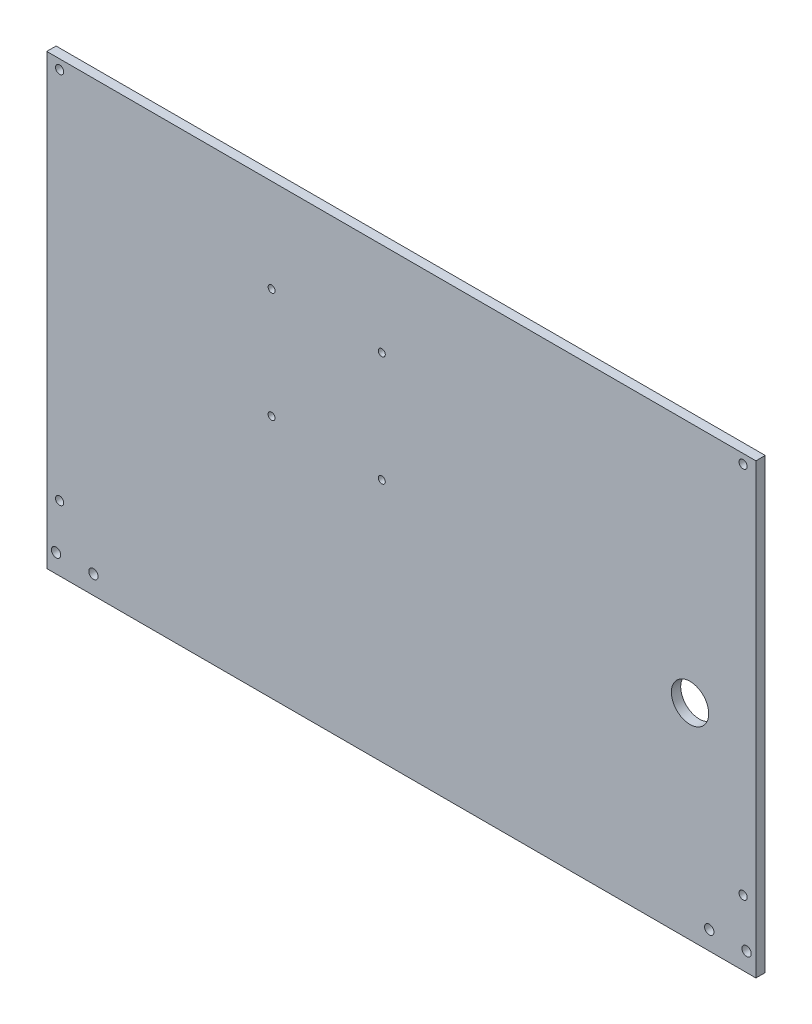
ISO-10303-21;
HEADER;
FILE_DESCRIPTION(('STEP AP214'),'2;1');
FILE_NAME('part.step','',(''),(''),'','','');
FILE_SCHEMA(('AUTOMOTIVE_DESIGN { 1 0 10303 214 1 1 1 1 }'));
ENDSEC;
DATA;
#1=APPLICATION_CONTEXT('core data for automotive mechanical design processes');
#2=APPLICATION_PROTOCOL_DEFINITION('international standard','automotive_design',2000,#1);
#3=PRODUCT_CONTEXT('',#1,'mechanical');
#4=PRODUCT('Part','Part','',(#3));
#5=PRODUCT_RELATED_PRODUCT_CATEGORY('part','',(#4));
#6=PRODUCT_DEFINITION_FORMATION('','',#4);
#7=PRODUCT_DEFINITION_CONTEXT('part definition',#1,'design');
#8=PRODUCT_DEFINITION('design','',#6,#7);
#9=PRODUCT_DEFINITION_SHAPE('','',#8);
#10=(LENGTH_UNIT() NAMED_UNIT(*) SI_UNIT(.MILLI.,.METRE.));
#11=(NAMED_UNIT(*) PLANE_ANGLE_UNIT() SI_UNIT($,.RADIAN.));
#12=(NAMED_UNIT(*) SI_UNIT($,.STERADIAN.) SOLID_ANGLE_UNIT());
#13=UNCERTAINTY_MEASURE_WITH_UNIT(LENGTH_MEASURE(1.E-05),#10,'distance_accuracy_value','');
#14=(GEOMETRIC_REPRESENTATION_CONTEXT(3) GLOBAL_UNCERTAINTY_ASSIGNED_CONTEXT((#13)) GLOBAL_UNIT_ASSIGNED_CONTEXT((#10,
#11,#12)) REPRESENTATION_CONTEXT('',''));
#15=CARTESIAN_POINT('',(0.,0.,0.));
#16=DIRECTION('',(0.,0.,1.));
#17=DIRECTION('',(1.,0.,0.));
#18=AXIS2_PLACEMENT_3D('',#15,#16,#17);
#19=CARTESIAN_POINT('',(241.3,-152.4,6.35));
#20=DIRECTION('',(-1.,0.,0.));
#21=DIRECTION('',(0.,0.,1.));
#22=AXIS2_PLACEMENT_3D('',#19,#20,#21);
#23=PLANE('',#22);
#24=DIRECTION('',(0.,1.,0.));
#25=VECTOR('',#24,1.);
#26=CARTESIAN_POINT('',(241.3,-152.4,0.));
#27=LINE('',#26,#25);
#28=CARTESIAN_POINT('',(241.3,-152.4,0.));
#29=VERTEX_POINT('',#28);
#30=CARTESIAN_POINT('',(241.3,152.4,0.));
#31=VERTEX_POINT('',#30);
#32=EDGE_CURVE('E110',#29,#31,#27,.T.);
#33=ORIENTED_EDGE('',*,*,#32,.T.);
#34=DIRECTION('',(0.,0.,-1.));
#35=VECTOR('',#34,1.);
#36=CARTESIAN_POINT('',(241.3,152.4,6.35));
#37=LINE('',#36,#35);
#38=CARTESIAN_POINT('',(241.3,152.4,6.35));
#39=VERTEX_POINT('',#38);
#40=EDGE_CURVE('E11',#39,#31,#37,.T.);
#41=ORIENTED_EDGE('',*,*,#40,.F.);
#42=DIRECTION('',(0.,1.,0.));
#43=VECTOR('',#42,1.);
#44=CARTESIAN_POINT('',(241.3,-152.4,6.35));
#45=LINE('',#44,#43);
#46=CARTESIAN_POINT('',(241.3,-152.4,6.35));
#47=VERTEX_POINT('',#46);
#48=EDGE_CURVE('E94',#47,#39,#45,.T.);
#49=ORIENTED_EDGE('',*,*,#48,.F.);
#50=DIRECTION('',(0.,0.,-1.));
#51=VECTOR('',#50,1.);
#52=CARTESIAN_POINT('',(241.3,-152.4,6.35));
#53=LINE('',#52,#51);
#54=EDGE_CURVE('E106',#47,#29,#53,.T.);
#55=ORIENTED_EDGE('',*,*,#54,.T.);
#56=EDGE_LOOP('',(#33,#41,#49,#55));
#57=FACE_BOUND('',#56,.T.);
#58=ADVANCED_FACE('F42',(#57),#23,.F.);
#59=CARTESIAN_POINT('',(-241.3,152.4,6.35));
#60=DIRECTION('',(0.,-1.,0.));
#61=DIRECTION('',(0.,0.,-1.));
#62=AXIS2_PLACEMENT_3D('',#59,#60,#61);
#63=PLANE('',#62);
#64=DIRECTION('',(-1.,0.,0.));
#65=VECTOR('',#64,1.);
#66=CARTESIAN_POINT('',(-241.3,152.4,0.));
#67=LINE('',#66,#65);
#68=CARTESIAN_POINT('',(-241.3,152.4,0.));
#69=VERTEX_POINT('',#68);
#70=EDGE_CURVE('E99',#31,#69,#67,.T.);
#71=ORIENTED_EDGE('',*,*,#70,.T.);
#72=DIRECTION('',(0.,0.,-1.));
#73=VECTOR('',#72,1.);
#74=CARTESIAN_POINT('',(-241.3,152.4,6.35));
#75=LINE('',#74,#73);
#76=CARTESIAN_POINT('',(-241.3,152.4,6.35));
#77=VERTEX_POINT('',#76);
#78=EDGE_CURVE('E51',#77,#69,#75,.T.);
#79=ORIENTED_EDGE('',*,*,#78,.F.);
#80=DIRECTION('',(-1.,0.,0.));
#81=VECTOR('',#80,1.);
#82=CARTESIAN_POINT('',(-241.3,152.4,6.35));
#83=LINE('',#82,#81);
#84=EDGE_CURVE('E89',#39,#77,#83,.T.);
#85=ORIENTED_EDGE('',*,*,#84,.F.);
#86=ORIENTED_EDGE('',*,*,#40,.T.);
#87=EDGE_LOOP('',(#71,#79,#85,#86));
#88=FACE_BOUND('',#87,.T.);
#89=ADVANCED_FACE('F98',(#88),#63,.F.);
#90=CARTESIAN_POINT('',(-241.3,-152.4,6.35));
#91=DIRECTION('',(1.,0.,0.));
#92=DIRECTION('',(0.,0.,-1.));
#93=AXIS2_PLACEMENT_3D('',#90,#91,#92);
#94=PLANE('',#93);
#95=DIRECTION('',(0.,-1.,0.));
#96=VECTOR('',#95,1.);
#97=CARTESIAN_POINT('',(-241.3,-152.4,0.));
#98=LINE('',#97,#96);
#99=CARTESIAN_POINT('',(-241.3,-152.4,0.));
#100=VERTEX_POINT('',#99);
#101=EDGE_CURVE('E76',#69,#100,#98,.T.);
#102=ORIENTED_EDGE('',*,*,#101,.T.);
#103=DIRECTION('',(0.,0.,-1.));
#104=VECTOR('',#103,1.);
#105=CARTESIAN_POINT('',(-241.3,-152.4,6.35));
#106=LINE('',#105,#104);
#107=CARTESIAN_POINT('',(-241.3,-152.4,6.35));
#108=VERTEX_POINT('',#107);
#109=EDGE_CURVE('E101',#108,#100,#106,.T.);
#110=ORIENTED_EDGE('',*,*,#109,.F.);
#111=DIRECTION('',(0.,-1.,0.));
#112=VECTOR('',#111,1.);
#113=CARTESIAN_POINT('',(-241.3,-152.4,6.35));
#114=LINE('',#113,#112);
#115=EDGE_CURVE('E92',#77,#108,#114,.T.);
#116=ORIENTED_EDGE('',*,*,#115,.F.);
#117=ORIENTED_EDGE('',*,*,#78,.T.);
#118=EDGE_LOOP('',(#102,#110,#116,#117));
#119=FACE_BOUND('',#118,.T.);
#120=ADVANCED_FACE('F102',(#119),#94,.F.);
#121=CARTESIAN_POINT('',(-241.3,-152.4,6.35));
#122=DIRECTION('',(0.,1.,0.));
#123=DIRECTION('',(0.,0.,1.));
#124=AXIS2_PLACEMENT_3D('',#121,#122,#123);
#125=PLANE('',#124);
#126=DIRECTION('',(1.,0.,0.));
#127=VECTOR('',#126,1.);
#128=CARTESIAN_POINT('',(-241.3,-152.4,0.));
#129=LINE('',#128,#127);
#130=EDGE_CURVE('E82',#100,#29,#129,.T.);
#131=ORIENTED_EDGE('',*,*,#130,.T.);
#132=ORIENTED_EDGE('',*,*,#54,.F.);
#133=DIRECTION('',(1.,0.,0.));
#134=VECTOR('',#133,1.);
#135=CARTESIAN_POINT('',(-241.3,-152.4,6.35));
#136=LINE('',#135,#134);
#137=EDGE_CURVE('E59',#108,#47,#136,.T.);
#138=ORIENTED_EDGE('',*,*,#137,.F.);
#139=ORIENTED_EDGE('',*,*,#109,.T.);
#140=EDGE_LOOP('',(#131,#132,#138,#139));
#141=FACE_BOUND('',#140,.T.);
#142=ADVANCED_FACE('F124',(#141),#125,.F.);
#143=CARTESIAN_POINT('',(0.,0.,6.35));
#144=DIRECTION('',(0.,0.,-1.));
#145=DIRECTION('',(-1.,0.,0.));
#146=AXIS2_PLACEMENT_3D('',#143,#144,#145);
#147=PLANE('',#146);
#148=CARTESIAN_POINT('',(-88.3,88.9,6.35));
#149=DIRECTION('',(0.,0.,1.));
#150=DIRECTION('',(1.,0.,0.));
#151=AXIS2_PLACEMENT_3D('',#148,#149,#150);
#152=CIRCLE('',#151,2.3749);
#153=CARTESIAN_POINT('',(-85.9251,88.9,6.35));
#154=VERTEX_POINT('',#153);
#155=EDGE_CURVE('E215',#154,#154,#152,.T.);
#156=ORIENTED_EDGE('',*,*,#155,.F.);
#157=EDGE_LOOP('',(#156));
#158=FACE_BOUND('',#157,.T.);
#159=CARTESIAN_POINT('',(-88.3,13.9,6.35));
#160=DIRECTION('',(0.,0.,1.));
#161=DIRECTION('',(1.,0.,0.));
#162=AXIS2_PLACEMENT_3D('',#159,#160,#161);
#163=CIRCLE('',#162,2.3749);
#164=CARTESIAN_POINT('',(-85.9251,13.9,6.35));
#165=VERTEX_POINT('',#164);
#166=EDGE_CURVE('E223',#165,#165,#163,.T.);
#167=ORIENTED_EDGE('',*,*,#166,.F.);
#168=EDGE_LOOP('',(#167));
#169=FACE_BOUND('',#168,.T.);
#170=CARTESIAN_POINT('',(-13.3,13.9,6.35));
#171=DIRECTION('',(0.,0.,1.));
#172=DIRECTION('',(1.,0.,0.));
#173=AXIS2_PLACEMENT_3D('',#170,#171,#172);
#174=CIRCLE('',#173,2.3749);
#175=CARTESIAN_POINT('',(-10.9251,13.9,6.35));
#176=VERTEX_POINT('',#175);
#177=EDGE_CURVE('E207',#176,#176,#174,.T.);
#178=ORIENTED_EDGE('',*,*,#177,.F.);
#179=EDGE_LOOP('',(#178));
#180=FACE_BOUND('',#179,.T.);
#181=CARTESIAN_POINT('',(-13.3,88.9,6.35));
#182=DIRECTION('',(0.,0.,1.));
#183=DIRECTION('',(1.,0.,0.));
#184=AXIS2_PLACEMENT_3D('',#181,#182,#183);
#185=CIRCLE('',#184,2.3749);
#186=CARTESIAN_POINT('',(-10.9251,88.9,6.35));
#187=VERTEX_POINT('',#186);
#188=EDGE_CURVE('E203',#187,#187,#185,.T.);
#189=ORIENTED_EDGE('',*,*,#188,.F.);
#190=EDGE_LOOP('',(#189));
#191=FACE_BOUND('',#190,.T.);
#192=CARTESIAN_POINT('',(196.469,-12.7,6.35));
#193=DIRECTION('',(0.,0.,1.));
#194=DIRECTION('',(1.,0.,0.));
#195=AXIS2_PLACEMENT_3D('',#192,#193,#194);
#196=CIRCLE('',#195,12.7);
#197=CARTESIAN_POINT('',(209.169,-12.7,6.35));
#198=VERTEX_POINT('',#197);
#199=EDGE_CURVE('E195',#198,#198,#196,.T.);
#200=ORIENTED_EDGE('',*,*,#199,.F.);
#201=EDGE_LOOP('',(#200));
#202=FACE_BOUND('',#201,.T.);
#203=CARTESIAN_POINT('',(234.95,-139.7,6.35));
#204=DIRECTION('',(0.,0.,-1.));
#205=DIRECTION('',(-1.,0.,0.));
#206=AXIS2_PLACEMENT_3D('',#203,#204,#205);
#207=CIRCLE('',#206,3.175);
#208=CARTESIAN_POINT('',(231.775,-139.7,6.35));
#209=VERTEX_POINT('',#208);
#210=EDGE_CURVE('E188',#209,#209,#207,.T.);
#211=ORIENTED_EDGE('',*,*,#210,.T.);
#212=EDGE_LOOP('',(#211));
#213=FACE_BOUND('',#212,.T.);
#214=CARTESIAN_POINT('',(209.55,-139.7,6.35));
#215=DIRECTION('',(0.,0.,-1.));
#216=DIRECTION('',(-1.,0.,0.));
#217=AXIS2_PLACEMENT_3D('',#214,#215,#216);
#218=CIRCLE('',#217,3.17499999999997);
#219=CARTESIAN_POINT('',(206.375,-139.7,6.35));
#220=VERTEX_POINT('',#219);
#221=EDGE_CURVE('E179',#220,#220,#218,.T.);
#222=ORIENTED_EDGE('',*,*,#221,.T.);
#223=EDGE_LOOP('',(#222));
#224=FACE_BOUND('',#223,.T.);
#225=CARTESIAN_POINT('',(-234.95,-139.7,6.35));
#226=DIRECTION('',(0.,0.,1.));
#227=DIRECTION('',(1.,0.,0.));
#228=AXIS2_PLACEMENT_3D('',#225,#226,#227);
#229=CIRCLE('',#228,3.175);
#230=CARTESIAN_POINT('',(-231.775,-139.7,6.35));
#231=VERTEX_POINT('',#230);
#232=EDGE_CURVE('E172',#231,#231,#229,.T.);
#233=ORIENTED_EDGE('',*,*,#232,.F.);
#234=EDGE_LOOP('',(#233));
#235=FACE_BOUND('',#234,.T.);
#236=CARTESIAN_POINT('',(-209.55,-139.7,6.35));
#237=DIRECTION('',(0.,0.,1.));
#238=DIRECTION('',(1.,0.,0.));
#239=AXIS2_PLACEMENT_3D('',#236,#237,#238);
#240=CIRCLE('',#239,3.17499999999997);
#241=CARTESIAN_POINT('',(-206.375,-139.7,6.35));
#242=VERTEX_POINT('',#241);
#243=EDGE_CURVE('E167',#242,#242,#240,.T.);
#244=ORIENTED_EDGE('',*,*,#243,.F.);
#245=EDGE_LOOP('',(#244));
#246=FACE_BOUND('',#245,.T.);
#247=CARTESIAN_POINT('',(232.5624,146.05,6.35));
#248=DIRECTION('',(0.,0.,-1.));
#249=DIRECTION('',(-1.,0.,0.));
#250=AXIS2_PLACEMENT_3D('',#247,#248,#249);
#251=CIRCLE('',#250,2.78129999999998);
#252=CARTESIAN_POINT('',(229.7811,146.05,6.35));
#253=VERTEX_POINT('',#252);
#254=EDGE_CURVE('E156',#253,#253,#251,.T.);
#255=ORIENTED_EDGE('',*,*,#254,.T.);
#256=EDGE_LOOP('',(#255));
#257=FACE_BOUND('',#256,.T.);
#258=CARTESIAN_POINT('',(232.5624,-107.95,6.35));
#259=DIRECTION('',(0.,0.,-1.));
#260=DIRECTION('',(-1.,0.,0.));
#261=AXIS2_PLACEMENT_3D('',#258,#259,#260);
#262=CIRCLE('',#261,2.78130000000001);
#263=CARTESIAN_POINT('',(229.7811,-107.95,6.35));
#264=VERTEX_POINT('',#263);
#265=EDGE_CURVE('E147',#264,#264,#262,.T.);
#266=ORIENTED_EDGE('',*,*,#265,.T.);
#267=EDGE_LOOP('',(#266));
#268=FACE_BOUND('',#267,.T.);
#269=CARTESIAN_POINT('',(-232.5624,146.05,6.35));
#270=DIRECTION('',(0.,0.,1.));
#271=DIRECTION('',(1.,0.,0.));
#272=AXIS2_PLACEMENT_3D('',#269,#270,#271);
#273=CIRCLE('',#272,2.78129999999998);
#274=CARTESIAN_POINT('',(-229.7811,146.05,6.35));
#275=VERTEX_POINT('',#274);
#276=EDGE_CURVE('E140',#275,#275,#273,.T.);
#277=ORIENTED_EDGE('',*,*,#276,.F.);
#278=EDGE_LOOP('',(#277));
#279=FACE_BOUND('',#278,.T.);
#280=CARTESIAN_POINT('',(-232.5624,-107.95,6.35));
#281=DIRECTION('',(0.,0.,1.));
#282=DIRECTION('',(1.,0.,0.));
#283=AXIS2_PLACEMENT_3D('',#280,#281,#282);
#284=CIRCLE('',#283,2.78130000000001);
#285=CARTESIAN_POINT('',(-229.7811,-107.95,6.35));
#286=VERTEX_POINT('',#285);
#287=EDGE_CURVE('E135',#286,#286,#284,.T.);
#288=ORIENTED_EDGE('',*,*,#287,.F.);
#289=EDGE_LOOP('',(#288));
#290=FACE_BOUND('',#289,.T.);
#291=ORIENTED_EDGE('',*,*,#48,.T.);
#292=ORIENTED_EDGE('',*,*,#84,.T.);
#293=ORIENTED_EDGE('',*,*,#115,.T.);
#294=ORIENTED_EDGE('',*,*,#137,.T.);
#295=EDGE_LOOP('',(#291,#292,#293,#294));
#296=FACE_BOUND('',#295,.T.);
#297=ADVANCED_FACE('F90',(#158,#169,#180,#191,#202,#213,#224,#235,#246,#257,#268,#279,#290,
#296),#147,.F.);
#298=CARTESIAN_POINT('',(0.,0.,0.));
#299=DIRECTION('',(0.,0.,-1.));
#300=DIRECTION('',(-1.,0.,0.));
#301=AXIS2_PLACEMENT_3D('',#298,#299,#300);
#302=PLANE('',#301);
#303=CARTESIAN_POINT('',(-88.3,88.9,0.));
#304=DIRECTION('',(0.,0.,1.));
#305=DIRECTION('',(1.,0.,0.));
#306=AXIS2_PLACEMENT_3D('',#303,#304,#305);
#307=CIRCLE('',#306,2.3749);
#308=CARTESIAN_POINT('',(-85.9251,88.9,0.));
#309=VERTEX_POINT('',#308);
#310=EDGE_CURVE('E211',#309,#309,#307,.T.);
#311=ORIENTED_EDGE('',*,*,#310,.T.);
#312=EDGE_LOOP('',(#311));
#313=FACE_BOUND('',#312,.T.);
#314=CARTESIAN_POINT('',(-88.3,13.9,0.));
#315=DIRECTION('',(0.,0.,1.));
#316=DIRECTION('',(1.,0.,0.));
#317=AXIS2_PLACEMENT_3D('',#314,#315,#316);
#318=CIRCLE('',#317,2.3749);
#319=CARTESIAN_POINT('',(-85.9251,13.9,0.));
#320=VERTEX_POINT('',#319);
#321=EDGE_CURVE('E219',#320,#320,#318,.T.);
#322=ORIENTED_EDGE('',*,*,#321,.T.);
#323=EDGE_LOOP('',(#322));
#324=FACE_BOUND('',#323,.T.);
#325=CARTESIAN_POINT('',(-13.3,13.9,0.));
#326=DIRECTION('',(0.,0.,1.));
#327=DIRECTION('',(1.,0.,0.));
#328=AXIS2_PLACEMENT_3D('',#325,#326,#327);
#329=CIRCLE('',#328,2.3749);
#330=CARTESIAN_POINT('',(-10.9251,13.9,0.));
#331=VERTEX_POINT('',#330);
#332=EDGE_CURVE('E227',#331,#331,#329,.T.);
#333=ORIENTED_EDGE('',*,*,#332,.T.);
#334=EDGE_LOOP('',(#333));
#335=FACE_BOUND('',#334,.T.);
#336=CARTESIAN_POINT('',(-13.3,88.9,0.));
#337=DIRECTION('',(0.,0.,1.));
#338=DIRECTION('',(1.,0.,0.));
#339=AXIS2_PLACEMENT_3D('',#336,#337,#338);
#340=CIRCLE('',#339,2.3749);
#341=CARTESIAN_POINT('',(-10.9251,88.9,0.));
#342=VERTEX_POINT('',#341);
#343=EDGE_CURVE('E199',#342,#342,#340,.T.);
#344=ORIENTED_EDGE('',*,*,#343,.T.);
#345=EDGE_LOOP('',(#344));
#346=FACE_BOUND('',#345,.T.);
#347=CARTESIAN_POINT('',(196.469,-12.7,0.));
#348=DIRECTION('',(0.,0.,1.));
#349=DIRECTION('',(1.,0.,0.));
#350=AXIS2_PLACEMENT_3D('',#347,#348,#349);
#351=CIRCLE('',#350,12.7);
#352=CARTESIAN_POINT('',(209.169,-12.7,0.));
#353=VERTEX_POINT('',#352);
#354=EDGE_CURVE('E184',#353,#353,#351,.T.);
#355=ORIENTED_EDGE('',*,*,#354,.T.);
#356=EDGE_LOOP('',(#355));
#357=FACE_BOUND('',#356,.T.);
#358=CARTESIAN_POINT('',(234.95,-139.7,0.));
#359=DIRECTION('',(0.,0.,-1.));
#360=DIRECTION('',(-1.,0.,0.));
#361=AXIS2_PLACEMENT_3D('',#358,#359,#360);
#362=CIRCLE('',#361,3.175);
#363=CARTESIAN_POINT('',(231.775,-139.7,0.));
#364=VERTEX_POINT('',#363);
#365=EDGE_CURVE('E168',#364,#364,#362,.T.);
#366=ORIENTED_EDGE('',*,*,#365,.F.);
#367=EDGE_LOOP('',(#366));
#368=FACE_BOUND('',#367,.T.);
#369=CARTESIAN_POINT('',(209.55,-139.7,0.));
#370=DIRECTION('',(0.,0.,-1.));
#371=DIRECTION('',(-1.,0.,0.));
#372=AXIS2_PLACEMENT_3D('',#369,#370,#371);
#373=CIRCLE('',#372,3.17499999999997);
#374=CARTESIAN_POINT('',(206.375,-139.7,0.));
#375=VERTEX_POINT('',#374);
#376=EDGE_CURVE('E183',#375,#375,#373,.T.);
#377=ORIENTED_EDGE('',*,*,#376,.F.);
#378=EDGE_LOOP('',(#377));
#379=FACE_BOUND('',#378,.T.);
#380=CARTESIAN_POINT('',(-234.95,-139.7,0.));
#381=DIRECTION('',(0.,0.,1.));
#382=DIRECTION('',(1.,0.,0.));
#383=AXIS2_PLACEMENT_3D('',#380,#381,#382);
#384=CIRCLE('',#383,3.175);
#385=CARTESIAN_POINT('',(-231.775,-139.7,0.));
#386=VERTEX_POINT('',#385);
#387=EDGE_CURVE('E152',#386,#386,#384,.T.);
#388=ORIENTED_EDGE('',*,*,#387,.T.);
#389=EDGE_LOOP('',(#388));
#390=FACE_BOUND('',#389,.T.);
#391=CARTESIAN_POINT('',(-209.55,-139.7,0.));
#392=DIRECTION('',(0.,0.,1.));
#393=DIRECTION('',(1.,0.,0.));
#394=AXIS2_PLACEMENT_3D('',#391,#392,#393);
#395=CIRCLE('',#394,3.17499999999997);
#396=CARTESIAN_POINT('',(-206.375,-139.7,0.));
#397=VERTEX_POINT('',#396);
#398=EDGE_CURVE('E163',#397,#397,#395,.T.);
#399=ORIENTED_EDGE('',*,*,#398,.T.);
#400=EDGE_LOOP('',(#399));
#401=FACE_BOUND('',#400,.T.);
#402=CARTESIAN_POINT('',(232.5624,146.05,0.));
#403=DIRECTION('',(0.,0.,-1.));
#404=DIRECTION('',(-1.,0.,0.));
#405=AXIS2_PLACEMENT_3D('',#402,#403,#404);
#406=CIRCLE('',#405,2.78129999999998);
#407=CARTESIAN_POINT('',(229.7811,146.05,0.));
#408=VERTEX_POINT('',#407);
#409=EDGE_CURVE('E136',#408,#408,#406,.T.);
#410=ORIENTED_EDGE('',*,*,#409,.F.);
#411=EDGE_LOOP('',(#410));
#412=FACE_BOUND('',#411,.T.);
#413=CARTESIAN_POINT('',(232.5624,-107.95,0.));
#414=DIRECTION('',(0.,0.,-1.));
#415=DIRECTION('',(-1.,0.,0.));
#416=AXIS2_PLACEMENT_3D('',#413,#414,#415);
#417=CIRCLE('',#416,2.78130000000001);
#418=CARTESIAN_POINT('',(229.7811,-107.95,0.));
#419=VERTEX_POINT('',#418);
#420=EDGE_CURVE('E151',#419,#419,#417,.T.);
#421=ORIENTED_EDGE('',*,*,#420,.F.);
#422=EDGE_LOOP('',(#421));
#423=FACE_BOUND('',#422,.T.);
#424=CARTESIAN_POINT('',(-232.5624,146.05,0.));
#425=DIRECTION('',(0.,0.,1.));
#426=DIRECTION('',(1.,0.,0.));
#427=AXIS2_PLACEMENT_3D('',#424,#425,#426);
#428=CIRCLE('',#427,2.78129999999998);
#429=CARTESIAN_POINT('',(-229.7811,146.05,0.));
#430=VERTEX_POINT('',#429);
#431=EDGE_CURVE('E114',#430,#430,#428,.T.);
#432=ORIENTED_EDGE('',*,*,#431,.T.);
#433=EDGE_LOOP('',(#432));
#434=FACE_BOUND('',#433,.T.);
#435=CARTESIAN_POINT('',(-232.5624,-107.95,0.));
#436=DIRECTION('',(0.,0.,1.));
#437=DIRECTION('',(1.,0.,0.));
#438=AXIS2_PLACEMENT_3D('',#435,#436,#437);
#439=CIRCLE('',#438,2.78130000000001);
#440=CARTESIAN_POINT('',(-229.7811,-107.95,0.));
#441=VERTEX_POINT('',#440);
#442=EDGE_CURVE('E131',#441,#441,#439,.T.);
#443=ORIENTED_EDGE('',*,*,#442,.T.);
#444=EDGE_LOOP('',(#443));
#445=FACE_BOUND('',#444,.T.);
#446=ORIENTED_EDGE('',*,*,#32,.F.);
#447=ORIENTED_EDGE('',*,*,#130,.F.);
#448=ORIENTED_EDGE('',*,*,#101,.F.);
#449=ORIENTED_EDGE('',*,*,#70,.F.);
#450=EDGE_LOOP('',(#446,#447,#448,#449));
#451=FACE_BOUND('',#450,.T.);
#452=ADVANCED_FACE('F127',(#313,#324,#335,#346,#357,#368,#379,#390,#401,#412,#423,#434,#445,
#451),#302,.T.);
#453=CARTESIAN_POINT('',(-232.5624,-107.95,0.));
#454=DIRECTION('',(0.,0.,1.));
#455=DIRECTION('',(1.,0.,0.));
#456=AXIS2_PLACEMENT_3D('',#453,#454,#455);
#457=CYLINDRICAL_SURFACE('',#456,2.78130000000001);
#458=ORIENTED_EDGE('',*,*,#442,.F.);
#459=EDGE_LOOP('',(#458));
#460=FACE_BOUND('',#459,.T.);
#461=ORIENTED_EDGE('',*,*,#287,.T.);
#462=EDGE_LOOP('',(#461));
#463=FACE_BOUND('',#462,.T.);
#464=ADVANCED_FACE('F261',(#460,#463),#457,.F.);
#465=CARTESIAN_POINT('',(-232.5624,146.05,0.));
#466=DIRECTION('',(0.,0.,1.));
#467=DIRECTION('',(1.,0.,0.));
#468=AXIS2_PLACEMENT_3D('',#465,#466,#467);
#469=CYLINDRICAL_SURFACE('',#468,2.78129999999998);
#470=ORIENTED_EDGE('',*,*,#431,.F.);
#471=EDGE_LOOP('',(#470));
#472=FACE_BOUND('',#471,.T.);
#473=ORIENTED_EDGE('',*,*,#276,.T.);
#474=EDGE_LOOP('',(#473));
#475=FACE_BOUND('',#474,.T.);
#476=ADVANCED_FACE('F263',(#472,#475),#469,.F.);
#477=CARTESIAN_POINT('',(232.5624,-107.95,0.));
#478=DIRECTION('',(0.,0.,1.));
#479=DIRECTION('',(1.,0.,0.));
#480=AXIS2_PLACEMENT_3D('',#477,#478,#479);
#481=CYLINDRICAL_SURFACE('',#480,2.78130000000001);
#482=ORIENTED_EDGE('',*,*,#420,.T.);
#483=EDGE_LOOP('',(#482));
#484=FACE_BOUND('',#483,.T.);
#485=ORIENTED_EDGE('',*,*,#265,.F.);
#486=EDGE_LOOP('',(#485));
#487=FACE_BOUND('',#486,.T.);
#488=ADVANCED_FACE('F270',(#484,#487),#481,.F.);
#489=CARTESIAN_POINT('',(232.5624,146.05,0.));
#490=DIRECTION('',(0.,0.,1.));
#491=DIRECTION('',(1.,0.,0.));
#492=AXIS2_PLACEMENT_3D('',#489,#490,#491);
#493=CYLINDRICAL_SURFACE('',#492,2.78129999999998);
#494=ORIENTED_EDGE('',*,*,#409,.T.);
#495=EDGE_LOOP('',(#494));
#496=FACE_BOUND('',#495,.T.);
#497=ORIENTED_EDGE('',*,*,#254,.F.);
#498=EDGE_LOOP('',(#497));
#499=FACE_BOUND('',#498,.T.);
#500=ADVANCED_FACE('F400',(#496,#499),#493,.F.);
#501=CARTESIAN_POINT('',(-209.55,-139.7,0.));
#502=DIRECTION('',(0.,0.,1.));
#503=DIRECTION('',(1.,0.,0.));
#504=AXIS2_PLACEMENT_3D('',#501,#502,#503);
#505=CYLINDRICAL_SURFACE('',#504,3.17499999999997);
#506=ORIENTED_EDGE('',*,*,#398,.F.);
#507=EDGE_LOOP('',(#506));
#508=FACE_BOUND('',#507,.T.);
#509=ORIENTED_EDGE('',*,*,#243,.T.);
#510=EDGE_LOOP('',(#509));
#511=FACE_BOUND('',#510,.T.);
#512=ADVANCED_FACE('F390',(#508,#511),#505,.F.);
#513=CARTESIAN_POINT('',(-234.95,-139.7,0.));
#514=DIRECTION('',(0.,0.,1.));
#515=DIRECTION('',(1.,0.,0.));
#516=AXIS2_PLACEMENT_3D('',#513,#514,#515);
#517=CYLINDRICAL_SURFACE('',#516,3.175);
#518=ORIENTED_EDGE('',*,*,#387,.F.);
#519=EDGE_LOOP('',(#518));
#520=FACE_BOUND('',#519,.T.);
#521=ORIENTED_EDGE('',*,*,#232,.T.);
#522=EDGE_LOOP('',(#521));
#523=FACE_BOUND('',#522,.T.);
#524=ADVANCED_FACE('F380',(#520,#523),#517,.F.);
#525=CARTESIAN_POINT('',(209.55,-139.7,0.));
#526=DIRECTION('',(0.,0.,1.));
#527=DIRECTION('',(1.,0.,0.));
#528=AXIS2_PLACEMENT_3D('',#525,#526,#527);
#529=CYLINDRICAL_SURFACE('',#528,3.17499999999997);
#530=ORIENTED_EDGE('',*,*,#376,.T.);
#531=EDGE_LOOP('',(#530));
#532=FACE_BOUND('',#531,.T.);
#533=ORIENTED_EDGE('',*,*,#221,.F.);
#534=EDGE_LOOP('',(#533));
#535=FACE_BOUND('',#534,.T.);
#536=ADVANCED_FACE('F370',(#532,#535),#529,.F.);
#537=CARTESIAN_POINT('',(234.95,-139.7,0.));
#538=DIRECTION('',(0.,0.,1.));
#539=DIRECTION('',(1.,0.,0.));
#540=AXIS2_PLACEMENT_3D('',#537,#538,#539);
#541=CYLINDRICAL_SURFACE('',#540,3.175);
#542=ORIENTED_EDGE('',*,*,#365,.T.);
#543=EDGE_LOOP('',(#542));
#544=FACE_BOUND('',#543,.T.);
#545=ORIENTED_EDGE('',*,*,#210,.F.);
#546=EDGE_LOOP('',(#545));
#547=FACE_BOUND('',#546,.T.);
#548=ADVANCED_FACE('F361',(#544,#547),#541,.F.);
#549=CARTESIAN_POINT('',(196.469,-12.7,0.));
#550=DIRECTION('',(0.,0.,1.));
#551=DIRECTION('',(1.,0.,0.));
#552=AXIS2_PLACEMENT_3D('',#549,#550,#551);
#553=CYLINDRICAL_SURFACE('',#552,12.7);
#554=ORIENTED_EDGE('',*,*,#354,.F.);
#555=EDGE_LOOP('',(#554));
#556=FACE_BOUND('',#555,.T.);
#557=ORIENTED_EDGE('',*,*,#199,.T.);
#558=EDGE_LOOP('',(#557));
#559=FACE_BOUND('',#558,.T.);
#560=ADVANCED_FACE('F314',(#556,#559),#553,.F.);
#561=CARTESIAN_POINT('',(-13.3,88.9,0.));
#562=DIRECTION('',(0.,0.,1.));
#563=DIRECTION('',(1.,0.,0.));
#564=AXIS2_PLACEMENT_3D('',#561,#562,#563);
#565=CYLINDRICAL_SURFACE('',#564,2.3749);
#566=ORIENTED_EDGE('',*,*,#343,.F.);
#567=EDGE_LOOP('',(#566));
#568=FACE_BOUND('',#567,.T.);
#569=ORIENTED_EDGE('',*,*,#188,.T.);
#570=EDGE_LOOP('',(#569));
#571=FACE_BOUND('',#570,.T.);
#572=ADVANCED_FACE('F309',(#568,#571),#565,.F.);
#573=CARTESIAN_POINT('',(-13.3,13.9,0.));
#574=DIRECTION('',(0.,0.,1.));
#575=DIRECTION('',(1.,0.,0.));
#576=AXIS2_PLACEMENT_3D('',#573,#574,#575);
#577=CYLINDRICAL_SURFACE('',#576,2.3749);
#578=ORIENTED_EDGE('',*,*,#332,.F.);
#579=EDGE_LOOP('',(#578));
#580=FACE_BOUND('',#579,.T.);
#581=ORIENTED_EDGE('',*,*,#177,.T.);
#582=EDGE_LOOP('',(#581));
#583=FACE_BOUND('',#582,.T.);
#584=ADVANCED_FACE('F235',(#580,#583),#577,.F.);
#585=CARTESIAN_POINT('',(-88.3,13.9,0.));
#586=DIRECTION('',(0.,0.,1.));
#587=DIRECTION('',(1.,0.,0.));
#588=AXIS2_PLACEMENT_3D('',#585,#586,#587);
#589=CYLINDRICAL_SURFACE('',#588,2.3749);
#590=ORIENTED_EDGE('',*,*,#321,.F.);
#591=EDGE_LOOP('',(#590));
#592=FACE_BOUND('',#591,.T.);
#593=ORIENTED_EDGE('',*,*,#166,.T.);
#594=EDGE_LOOP('',(#593));
#595=FACE_BOUND('',#594,.T.);
#596=ADVANCED_FACE('F327',(#592,#595),#589,.F.);
#597=CARTESIAN_POINT('',(-88.3,88.9,0.));
#598=DIRECTION('',(0.,0.,1.));
#599=DIRECTION('',(1.,0.,0.));
#600=AXIS2_PLACEMENT_3D('',#597,#598,#599);
#601=CYLINDRICAL_SURFACE('',#600,2.3749);
#602=ORIENTED_EDGE('',*,*,#310,.F.);
#603=EDGE_LOOP('',(#602));
#604=FACE_BOUND('',#603,.T.);
#605=ORIENTED_EDGE('',*,*,#155,.T.);
#606=EDGE_LOOP('',(#605));
#607=FACE_BOUND('',#606,.T.);
#608=ADVANCED_FACE('F338',(#604,#607),#601,.F.);
#609=CLOSED_SHELL('',(#58,#89,#120,#142,#297,#452,#464,#476,#488,#500,#512,#524,#536,#548,#560,
#572,#584,#596,#608));
#610=MANIFOLD_SOLID_BREP('B2',#609);
#611=ADVANCED_BREP_SHAPE_REPRESENTATION('',(#18,#610),#14);
#612=SHAPE_DEFINITION_REPRESENTATION(#9,#611);
ENDSEC;
END-ISO-10303-21;
